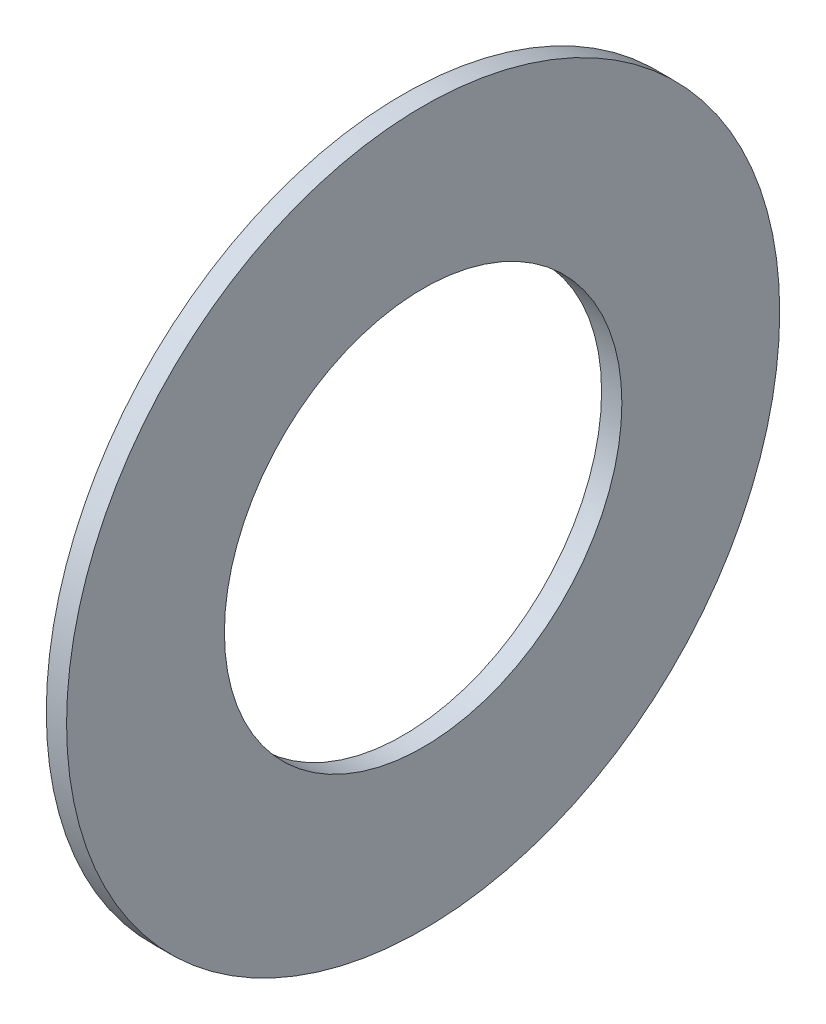
ISO-10303-21;
HEADER;
FILE_DESCRIPTION(('STEP AP214'),'2;1');
FILE_NAME('part.step','',(''),(''),'','','');
FILE_SCHEMA(('AUTOMOTIVE_DESIGN { 1 0 10303 214 1 1 1 1 }'));
ENDSEC;
DATA;
#1=APPLICATION_CONTEXT('core data for automotive mechanical design processes');
#2=APPLICATION_PROTOCOL_DEFINITION('international standard','automotive_design',2000,#1);
#3=PRODUCT_CONTEXT('',#1,'mechanical');
#4=PRODUCT('Part','Part','',(#3));
#5=PRODUCT_RELATED_PRODUCT_CATEGORY('part','',(#4));
#6=PRODUCT_DEFINITION_FORMATION('','',#4);
#7=PRODUCT_DEFINITION_CONTEXT('part definition',#1,'design');
#8=PRODUCT_DEFINITION('design','',#6,#7);
#9=PRODUCT_DEFINITION_SHAPE('','',#8);
#10=(LENGTH_UNIT() NAMED_UNIT(*) SI_UNIT(.MILLI.,.METRE.));
#11=(NAMED_UNIT(*) PLANE_ANGLE_UNIT() SI_UNIT($,.RADIAN.));
#12=(NAMED_UNIT(*) SI_UNIT($,.STERADIAN.) SOLID_ANGLE_UNIT());
#13=UNCERTAINTY_MEASURE_WITH_UNIT(LENGTH_MEASURE(1.E-05),#10,'distance_accuracy_value','');
#14=(GEOMETRIC_REPRESENTATION_CONTEXT(3) GLOBAL_UNCERTAINTY_ASSIGNED_CONTEXT((#13)) GLOBAL_UNIT_ASSIGNED_CONTEXT((#10,
#11,#12)) REPRESENTATION_CONTEXT('',''));
#15=CARTESIAN_POINT('',(0.,0.,0.));
#16=DIRECTION('',(0.,0.,1.));
#17=DIRECTION('',(1.,0.,0.));
#18=AXIS2_PLACEMENT_3D('',#15,#16,#17);
#19=CARTESIAN_POINT('',(0.8128,0.,0.));
#20=DIRECTION('',(1.,0.,0.));
#21=DIRECTION('',(0.,0.,-1.));
#22=AXIS2_PLACEMENT_3D('',#19,#20,#21);
#23=PLANE('',#22);
#24=CARTESIAN_POINT('',(0.8128,0.,0.));
#25=DIRECTION('',(1.,0.,0.));
#26=DIRECTION('',(0.,0.,-1.));
#27=AXIS2_PLACEMENT_3D('',#24,#25,#26);
#28=CIRCLE('',#27,14.2875);
#29=CARTESIAN_POINT('',(0.8128,0.,-14.2875));
#30=VERTEX_POINT('',#29);
#31=EDGE_CURVE('E10',#30,#30,#28,.T.);
#32=ORIENTED_EDGE('',*,*,#31,.T.);
#33=EDGE_LOOP('',(#32));
#34=FACE_BOUND('',#33,.T.);
#35=CARTESIAN_POINT('',(0.8128,0.,0.));
#36=DIRECTION('',(1.,0.,0.));
#37=DIRECTION('',(0.,0.,-1.));
#38=AXIS2_PLACEMENT_3D('',#35,#36,#37);
#39=CIRCLE('',#38,7.9629);
#40=CARTESIAN_POINT('',(0.8128,0.,-7.9629));
#41=VERTEX_POINT('',#40);
#42=EDGE_CURVE('E47',#41,#41,#39,.T.);
#43=ORIENTED_EDGE('',*,*,#42,.F.);
#44=EDGE_LOOP('',(#43));
#45=FACE_BOUND('',#44,.T.);
#46=ADVANCED_FACE('F36',(#34,#45),#23,.T.);
#47=CARTESIAN_POINT('',(0.,0.,0.));
#48=DIRECTION('',(1.,0.,0.));
#49=DIRECTION('',(0.,0.,-1.));
#50=AXIS2_PLACEMENT_3D('',#47,#48,#49);
#51=PLANE('',#50);
#52=CARTESIAN_POINT('',(0.,0.,0.));
#53=DIRECTION('',(1.,0.,0.));
#54=DIRECTION('',(0.,0.,-1.));
#55=AXIS2_PLACEMENT_3D('',#52,#53,#54);
#56=CIRCLE('',#55,14.2875);
#57=CARTESIAN_POINT('',(0.,0.,-14.2875));
#58=VERTEX_POINT('',#57);
#59=EDGE_CURVE('E40',#58,#58,#56,.T.);
#60=ORIENTED_EDGE('',*,*,#59,.F.);
#61=EDGE_LOOP('',(#60));
#62=FACE_BOUND('',#61,.T.);
#63=CARTESIAN_POINT('',(0.,0.,0.));
#64=DIRECTION('',(1.,0.,0.));
#65=DIRECTION('',(0.,0.,-1.));
#66=AXIS2_PLACEMENT_3D('',#63,#64,#65);
#67=CIRCLE('',#66,7.9629);
#68=CARTESIAN_POINT('',(0.,0.,-7.9629));
#69=VERTEX_POINT('',#68);
#70=EDGE_CURVE('E49',#69,#69,#67,.T.);
#71=ORIENTED_EDGE('',*,*,#70,.T.);
#72=EDGE_LOOP('',(#71));
#73=FACE_BOUND('',#72,.T.);
#74=ADVANCED_FACE('F59',(#62,#73),#51,.F.);
#75=CARTESIAN_POINT('',(0.8128,0.,0.));
#76=DIRECTION('',(-1.,0.,0.));
#77=DIRECTION('',(0.,0.,1.));
#78=AXIS2_PLACEMENT_3D('',#75,#76,#77);
#79=CYLINDRICAL_SURFACE('',#78,14.2875);
#80=ORIENTED_EDGE('',*,*,#31,.F.);
#81=EDGE_LOOP('',(#80));
#82=FACE_BOUND('',#81,.T.);
#83=ORIENTED_EDGE('',*,*,#59,.T.);
#84=EDGE_LOOP('',(#83));
#85=FACE_BOUND('',#84,.T.);
#86=ADVANCED_FACE('F38',(#82,#85),#79,.T.);
#87=CARTESIAN_POINT('',(0.8128,0.,0.));
#88=DIRECTION('',(-1.,0.,0.));
#89=DIRECTION('',(0.,0.,1.));
#90=AXIS2_PLACEMENT_3D('',#87,#88,#89);
#91=CYLINDRICAL_SURFACE('',#90,7.9629);
#92=ORIENTED_EDGE('',*,*,#42,.T.);
#93=EDGE_LOOP('',(#92));
#94=FACE_BOUND('',#93,.T.);
#95=ORIENTED_EDGE('',*,*,#70,.F.);
#96=EDGE_LOOP('',(#95));
#97=FACE_BOUND('',#96,.T.);
#98=ADVANCED_FACE('F55',(#94,#97),#91,.F.);
#99=CLOSED_SHELL('',(#46,#74,#86,#98));
#100=MANIFOLD_SOLID_BREP('B2',#99);
#101=ADVANCED_BREP_SHAPE_REPRESENTATION('',(#18,#100),#14);
#102=SHAPE_DEFINITION_REPRESENTATION(#9,#101);
ENDSEC;
END-ISO-10303-21;
